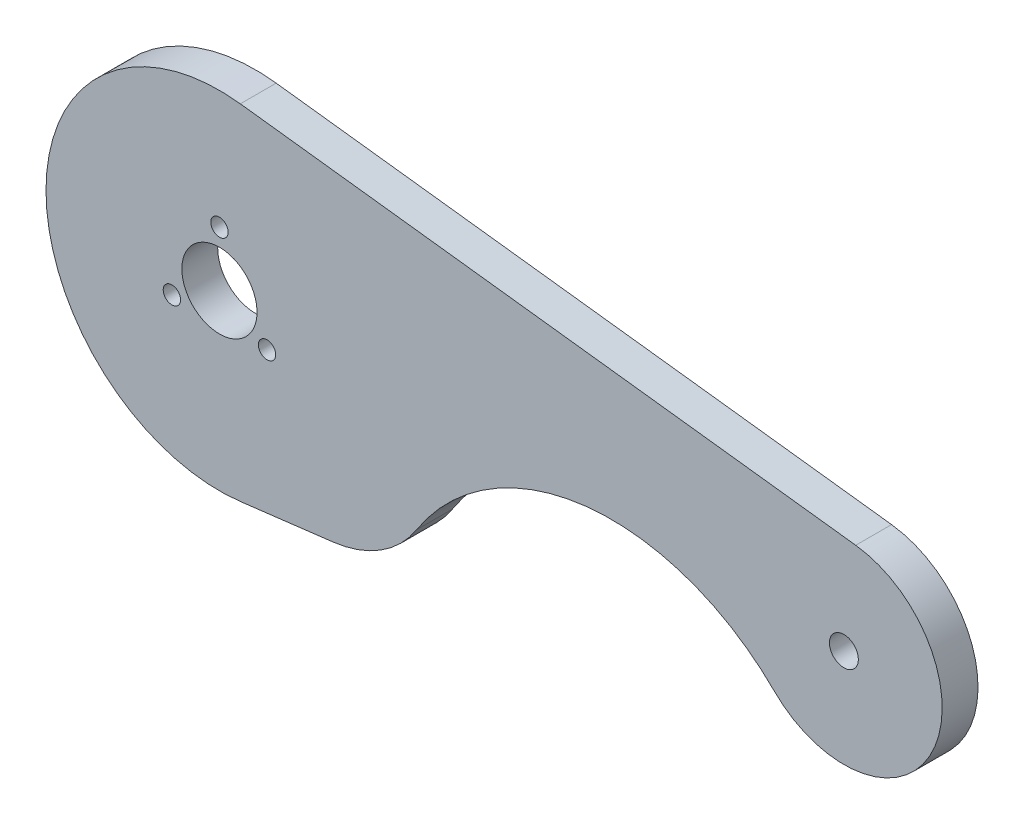
ISO-10303-21;
HEADER;
FILE_DESCRIPTION(('STEP AP214'),'2;1');
FILE_NAME('part.step','',(''),(''),'','','');
FILE_SCHEMA(('AUTOMOTIVE_DESIGN { 1 0 10303 214 1 1 1 1 }'));
ENDSEC;
DATA;
#1=APPLICATION_CONTEXT('core data for automotive mechanical design processes');
#2=APPLICATION_PROTOCOL_DEFINITION('international standard','automotive_design',2000,#1);
#3=PRODUCT_CONTEXT('',#1,'mechanical');
#4=PRODUCT('Part','Part','',(#3));
#5=PRODUCT_RELATED_PRODUCT_CATEGORY('part','',(#4));
#6=PRODUCT_DEFINITION_FORMATION('','',#4);
#7=PRODUCT_DEFINITION_CONTEXT('part definition',#1,'design');
#8=PRODUCT_DEFINITION('design','',#6,#7);
#9=PRODUCT_DEFINITION_SHAPE('','',#8);
#10=(LENGTH_UNIT() NAMED_UNIT(*) SI_UNIT(.MILLI.,.METRE.));
#11=(NAMED_UNIT(*) PLANE_ANGLE_UNIT() SI_UNIT($,.RADIAN.));
#12=(NAMED_UNIT(*) SI_UNIT($,.STERADIAN.) SOLID_ANGLE_UNIT());
#13=UNCERTAINTY_MEASURE_WITH_UNIT(LENGTH_MEASURE(1.E-05),#10,'distance_accuracy_value','');
#14=(GEOMETRIC_REPRESENTATION_CONTEXT(3) GLOBAL_UNCERTAINTY_ASSIGNED_CONTEXT((#13)) GLOBAL_UNIT_ASSIGNED_CONTEXT((#10,
#11,#12)) REPRESENTATION_CONTEXT('',''));
#15=CARTESIAN_POINT('',(0.,0.,0.));
#16=DIRECTION('',(0.,0.,1.));
#17=DIRECTION('',(1.,0.,0.));
#18=AXIS2_PLACEMENT_3D('',#15,#16,#17);
#19=CARTESIAN_POINT('',(17.2612629475506,-7.98027957065537,6.2));
#20=DIRECTION('',(0.,0.,-1.));
#21=DIRECTION('',(-1.,0.,0.));
#22=AXIS2_PLACEMENT_3D('',#19,#20,#21);
#23=CYLINDRICAL_SURFACE('',#22,20.);
#24=CARTESIAN_POINT('',(17.2612629475506,-7.98027957065537,0.));
#25=DIRECTION('',(0.,0.,1.));
#26=DIRECTION('',(1.,0.,0.));
#27=AXIS2_PLACEMENT_3D('',#24,#25,#26);
#28=CIRCLE('',#27,20.);
#29=CARTESIAN_POINT('',(34.095743925818,-18.7784391449695,0.));
#30=VERTEX_POINT('',#29);
#31=CARTESIAN_POINT('',(19.668670354958,-27.8348606434144,0.));
#32=VERTEX_POINT('',#31);
#33=EDGE_CURVE('E122',#30,#32,#28,.F.);
#34=ORIENTED_EDGE('',*,*,#33,.F.);
#35=DIRECTION('',(0.,0.,-1.));
#36=VECTOR('',#35,1.);
#37=CARTESIAN_POINT('',(34.095743925818,-18.7784391449695,6.2));
#38=LINE('',#37,#36);
#39=CARTESIAN_POINT('',(34.095743925818,-18.7784391449695,6.2));
#40=VERTEX_POINT('',#39);
#41=EDGE_CURVE('E11',#40,#30,#38,.T.);
#42=ORIENTED_EDGE('',*,*,#41,.F.);
#43=CARTESIAN_POINT('',(17.2612629475506,-7.98027957065537,6.2));
#44=DIRECTION('',(0.,0.,1.));
#45=DIRECTION('',(1.,0.,0.));
#46=AXIS2_PLACEMENT_3D('',#43,#44,#45);
#47=CIRCLE('',#46,20.);
#48=CARTESIAN_POINT('',(19.668670354958,-27.8348606434144,6.2));
#49=VERTEX_POINT('',#48);
#50=EDGE_CURVE('E141',#40,#49,#47,.F.);
#51=ORIENTED_EDGE('',*,*,#50,.T.);
#52=DIRECTION('',(0.,0.,-1.));
#53=VECTOR('',#52,1.);
#54=CARTESIAN_POINT('',(19.668670354958,-27.8348606434144,6.2));
#55=LINE('',#54,#53);
#56=EDGE_CURVE('E79',#49,#32,#55,.T.);
#57=ORIENTED_EDGE('',*,*,#56,.T.);
#58=EDGE_LOOP('',(#34,#42,#51,#57));
#59=FACE_BOUND('',#58,.T.);
#60=ADVANCED_FACE('F34',(#59),#23,.T.);
#61=CARTESIAN_POINT('',(67.764705882353,-40.3747582935977,6.2));
#62=DIRECTION('',(0.,0.,-1.));
#63=DIRECTION('',(-1.,0.,0.));
#64=AXIS2_PLACEMENT_3D('',#61,#62,#63);
#65=CYLINDRICAL_SURFACE('',#64,40.);
#66=CARTESIAN_POINT('',(67.764705882353,-40.3747582935977,0.));
#67=DIRECTION('',(0.,0.,1.));
#68=DIRECTION('',(1.,0.,0.));
#69=AXIS2_PLACEMENT_3D('',#66,#67,#68);
#70=CIRCLE('',#69,40.);
#71=CARTESIAN_POINT('',(96.,-12.0415945787923,0.));
#72=VERTEX_POINT('',#71);
#73=EDGE_CURVE('E125',#72,#30,#70,.T.);
#74=ORIENTED_EDGE('',*,*,#73,.F.);
#75=DIRECTION('',(0.,0.,-1.));
#76=VECTOR('',#75,1.);
#77=CARTESIAN_POINT('',(96.,-12.0415945787923,6.2));
#78=LINE('',#77,#76);
#79=CARTESIAN_POINT('',(96.,-12.0415945787923,6.2));
#80=VERTEX_POINT('',#79);
#81=EDGE_CURVE('E42',#80,#72,#78,.T.);
#82=ORIENTED_EDGE('',*,*,#81,.F.);
#83=CARTESIAN_POINT('',(67.764705882353,-40.3747582935977,6.2));
#84=DIRECTION('',(0.,0.,1.));
#85=DIRECTION('',(1.,0.,0.));
#86=AXIS2_PLACEMENT_3D('',#83,#84,#85);
#87=CIRCLE('',#86,40.);
#88=EDGE_CURVE('E154',#80,#40,#87,.T.);
#89=ORIENTED_EDGE('',*,*,#88,.T.);
#90=ORIENTED_EDGE('',*,*,#41,.T.);
#91=EDGE_LOOP('',(#74,#82,#89,#90));
#92=FACE_BOUND('',#91,.T.);
#93=ADVANCED_FACE('F153',(#92),#65,.F.);
#94=CARTESIAN_POINT('',(108.,0.,6.2));
#95=DIRECTION('',(0.,0.,-1.));
#96=DIRECTION('',(-1.,0.,0.));
#97=AXIS2_PLACEMENT_3D('',#94,#95,#96);
#98=CYLINDRICAL_SURFACE('',#97,17.);
#99=CARTESIAN_POINT('',(108.,0.,0.));
#100=DIRECTION('',(0.,0.,1.));
#101=DIRECTION('',(1.,0.,0.));
#102=AXIS2_PLACEMENT_3D('',#99,#100,#101);
#103=CIRCLE('',#102,17.);
#104=CARTESIAN_POINT('',(110.046296296296,16.8763939118452,0.));
#105=VERTEX_POINT('',#104);
#106=EDGE_CURVE('E129',#72,#105,#103,.T.);
#107=ORIENTED_EDGE('',*,*,#106,.T.);
#108=DIRECTION('',(0.,0.,-1.));
#109=VECTOR('',#108,1.);
#110=CARTESIAN_POINT('',(110.046296296296,16.8763939118452,6.2));
#111=LINE('',#110,#109);
#112=CARTESIAN_POINT('',(110.046296296296,16.8763939118452,6.2));
#113=VERTEX_POINT('',#112);
#114=EDGE_CURVE('E108',#113,#105,#111,.T.);
#115=ORIENTED_EDGE('',*,*,#114,.F.);
#116=CARTESIAN_POINT('',(108.,0.,6.2));
#117=DIRECTION('',(0.,0.,1.));
#118=DIRECTION('',(1.,0.,0.));
#119=AXIS2_PLACEMENT_3D('',#116,#117,#118);
#120=CIRCLE('',#119,17.);
#121=EDGE_CURVE('E99',#80,#113,#120,.T.);
#122=ORIENTED_EDGE('',*,*,#121,.F.);
#123=ORIENTED_EDGE('',*,*,#81,.T.);
#124=EDGE_LOOP('',(#107,#115,#122,#123));
#125=FACE_BOUND('',#124,.T.);
#126=ADVANCED_FACE('F146',(#125),#98,.T.);
#127=CARTESIAN_POINT('',(3.61111111111111,29.7818716091385,6.2));
#128=DIRECTION('',(-0.12037037037037,-0.99272905363795,0.));
#129=DIRECTION('',(0.99272905363795,-0.12037037037037,0.));
#130=AXIS2_PLACEMENT_3D('',#127,#128,#129);
#131=PLANE('',#130);
#132=DIRECTION('',(-0.99272905363795,0.12037037037037,0.));
#133=VECTOR('',#132,1.);
#134=CARTESIAN_POINT('',(3.61111111111111,29.7818716091385,0.));
#135=LINE('',#134,#133);
#136=CARTESIAN_POINT('',(3.61111111111111,29.7818716091385,0.));
#137=VERTEX_POINT('',#136);
#138=EDGE_CURVE('E107',#105,#137,#135,.T.);
#139=ORIENTED_EDGE('',*,*,#138,.T.);
#140=DIRECTION('',(0.,0.,-1.));
#141=VECTOR('',#140,1.);
#142=CARTESIAN_POINT('',(3.61111111111111,29.7818716091385,6.2));
#143=LINE('',#142,#141);
#144=CARTESIAN_POINT('',(3.61111111111111,29.7818716091385,6.2));
#145=VERTEX_POINT('',#144);
#146=EDGE_CURVE('E104',#145,#137,#143,.T.);
#147=ORIENTED_EDGE('',*,*,#146,.F.);
#148=DIRECTION('',(-0.99272905363795,0.12037037037037,0.));
#149=VECTOR('',#148,1.);
#150=CARTESIAN_POINT('',(3.61111111111111,29.7818716091385,6.2));
#151=LINE('',#150,#149);
#152=EDGE_CURVE('E91',#113,#145,#151,.T.);
#153=ORIENTED_EDGE('',*,*,#152,.F.);
#154=ORIENTED_EDGE('',*,*,#114,.T.);
#155=EDGE_LOOP('',(#139,#147,#153,#154));
#156=FACE_BOUND('',#155,.T.);
#157=ADVANCED_FACE('F105',(#156),#131,.F.);
#158=CARTESIAN_POINT('',(0.,-1.12289643393688E-13,6.2));
#159=DIRECTION('',(0.,0.,-1.));
#160=DIRECTION('',(-1.,0.,0.));
#161=AXIS2_PLACEMENT_3D('',#158,#159,#160);
#162=CYLINDRICAL_SURFACE('',#161,30.);
#163=CARTESIAN_POINT('',(0.,-1.12289643393688E-13,0.));
#164=DIRECTION('',(0.,0.,1.));
#165=DIRECTION('',(1.,0.,0.));
#166=AXIS2_PLACEMENT_3D('',#163,#164,#165);
#167=CIRCLE('',#166,30.);
#168=CARTESIAN_POINT('',(3.61111111111111,-29.7818716091385,0.));
#169=VERTEX_POINT('',#168);
#170=EDGE_CURVE('E72',#137,#169,#167,.T.);
#171=ORIENTED_EDGE('',*,*,#170,.T.);
#172=DIRECTION('',(0.,0.,-1.));
#173=VECTOR('',#172,1.);
#174=CARTESIAN_POINT('',(3.61111111111111,-29.7818716091385,6.2));
#175=LINE('',#174,#173);
#176=CARTESIAN_POINT('',(3.61111111111111,-29.7818716091385,6.2));
#177=VERTEX_POINT('',#176);
#178=EDGE_CURVE('E109',#177,#169,#175,.T.);
#179=ORIENTED_EDGE('',*,*,#178,.F.);
#180=CARTESIAN_POINT('',(0.,-1.12289643393688E-13,6.2));
#181=DIRECTION('',(0.,0.,1.));
#182=DIRECTION('',(1.,0.,0.));
#183=AXIS2_PLACEMENT_3D('',#180,#181,#182);
#184=CIRCLE('',#183,30.);
#185=EDGE_CURVE('E96',#145,#177,#184,.T.);
#186=ORIENTED_EDGE('',*,*,#185,.F.);
#187=ORIENTED_EDGE('',*,*,#146,.T.);
#188=EDGE_LOOP('',(#171,#179,#186,#187));
#189=FACE_BOUND('',#188,.T.);
#190=ADVANCED_FACE('F111',(#189),#162,.T.);
#191=CARTESIAN_POINT('',(0.,-1.12289643393688E-13,6.2));
#192=DIRECTION('',(0.,0.,-1.));
#193=DIRECTION('',(-1.,0.,0.));
#194=AXIS2_PLACEMENT_3D('',#191,#192,#193);
#195=CYLINDRICAL_SURFACE('',#194,6.5);
#196=CARTESIAN_POINT('',(0.,-1.12289643393688E-13,6.2));
#197=DIRECTION('',(0.,0.,1.));
#198=DIRECTION('',(1.,0.,0.));
#199=AXIS2_PLACEMENT_3D('',#196,#197,#198);
#200=CIRCLE('',#199,6.5);
#201=CARTESIAN_POINT('',(-6.5,-1.12289643393688E-13,6.2));
#202=VERTEX_POINT('',#201);
#203=EDGE_CURVE('E113',#202,#202,#200,.T.);
#204=CARTESIAN_POINT('',(0.,-1.12289643393688E-13,0.));
#205=DIRECTION('',(0.,0.,1.));
#206=DIRECTION('',(1.,0.,0.));
#207=AXIS2_PLACEMENT_3D('',#204,#205,#206);
#208=CIRCLE('',#207,6.5);
#209=CARTESIAN_POINT('',(-6.5,-1.12289643393688E-13,0.));
#210=VERTEX_POINT('',#209);
#211=EDGE_CURVE('E135',#210,#210,#208,.T.);
#212=CARTESIAN_POINT('',(-6.5,-1.12289643393688E-13,6.2));
#213=CARTESIAN_POINT('',(-6.5,-1.12289643393688E-13,6.13541666666667));
#214=CARTESIAN_POINT('',(-6.5,-1.12289643393688E-13,6.07083333333333));
#215=CARTESIAN_POINT('',(-6.5,-1.12289643393688E-13,5.94166666666667));
#216=CARTESIAN_POINT('',(-6.5,-1.12289643393688E-13,5.87708333333333));
#217=CARTESIAN_POINT('',(-6.5,-1.12289643393688E-13,5.74791666666667));
#218=CARTESIAN_POINT('',(-6.5,-1.12289643393688E-13,5.68333333333333));
#219=CARTESIAN_POINT('',(-6.5,-1.12289643393688E-13,5.55416666666667));
#220=CARTESIAN_POINT('',(-6.5,-1.12289643393688E-13,5.48958333333333));
#221=CARTESIAN_POINT('',(-6.5,-1.12289643393688E-13,5.36041666666667));
#222=CARTESIAN_POINT('',(-6.5,-1.12289643393688E-13,5.29583333333333));
#223=CARTESIAN_POINT('',(-6.5,-1.12289643393688E-13,5.16666666666667));
#224=CARTESIAN_POINT('',(-6.5,-1.12289643393688E-13,5.10208333333333));
#225=CARTESIAN_POINT('',(-6.5,-1.12289643393688E-13,4.97291666666667));
#226=CARTESIAN_POINT('',(-6.5,-1.12289643393688E-13,4.90833333333333));
#227=CARTESIAN_POINT('',(-6.5,-1.12289643393688E-13,4.77916666666667));
#228=CARTESIAN_POINT('',(-6.5,-1.12289643393688E-13,4.71458333333333));
#229=CARTESIAN_POINT('',(-6.5,-1.12289643393688E-13,4.58541666666667));
#230=CARTESIAN_POINT('',(-6.5,-1.12289643393688E-13,4.52083333333333));
#231=CARTESIAN_POINT('',(-6.5,-1.12289643393688E-13,4.39166666666667));
#232=CARTESIAN_POINT('',(-6.5,-1.12289643393688E-13,4.32708333333333));
#233=CARTESIAN_POINT('',(-6.5,-1.12289643393688E-13,4.19791666666667));
#234=CARTESIAN_POINT('',(-6.5,-1.12289643393688E-13,4.13333333333333));
#235=CARTESIAN_POINT('',(-6.5,-1.12289643393688E-13,4.00416666666667));
#236=CARTESIAN_POINT('',(-6.5,-1.12289643393688E-13,3.93958333333333));
#237=CARTESIAN_POINT('',(-6.5,-1.12289643393688E-13,3.81041666666667));
#238=CARTESIAN_POINT('',(-6.5,-1.12289643393688E-13,3.74583333333333));
#239=CARTESIAN_POINT('',(-6.5,-1.12289643393688E-13,3.61666666666667));
#240=CARTESIAN_POINT('',(-6.5,-1.12289643393688E-13,3.55208333333333));
#241=CARTESIAN_POINT('',(-6.5,-1.12289643393688E-13,3.42291666666667));
#242=CARTESIAN_POINT('',(-6.5,-1.12289643393688E-13,3.35833333333333));
#243=CARTESIAN_POINT('',(-6.5,-1.12289643393688E-13,3.22916666666667));
#244=CARTESIAN_POINT('',(-6.5,-1.12289643393688E-13,3.16458333333333));
#245=CARTESIAN_POINT('',(-6.5,-1.12289643393688E-13,3.03541666666667));
#246=CARTESIAN_POINT('',(-6.5,-1.12289643393688E-13,2.97083333333333));
#247=CARTESIAN_POINT('',(-6.5,-1.12289643393688E-13,2.84166666666667));
#248=CARTESIAN_POINT('',(-6.5,-1.12289643393688E-13,2.77708333333333));
#249=CARTESIAN_POINT('',(-6.5,-1.12289643393688E-13,2.64791666666667));
#250=CARTESIAN_POINT('',(-6.5,-1.12289643393688E-13,2.58333333333333));
#251=CARTESIAN_POINT('',(-6.5,-1.12289643393688E-13,2.45416666666667));
#252=CARTESIAN_POINT('',(-6.5,-1.12289643393688E-13,2.38958333333333));
#253=CARTESIAN_POINT('',(-6.5,-1.12289643393688E-13,2.26041666666667));
#254=CARTESIAN_POINT('',(-6.5,-1.12289643393688E-13,2.19583333333333));
#255=CARTESIAN_POINT('',(-6.5,-1.12289643393688E-13,2.06666666666667));
#256=CARTESIAN_POINT('',(-6.5,-1.12289643393688E-13,2.00208333333333));
#257=CARTESIAN_POINT('',(-6.5,-1.12289643393688E-13,1.87291666666667));
#258=CARTESIAN_POINT('',(-6.5,-1.12289643393688E-13,1.80833333333333));
#259=CARTESIAN_POINT('',(-6.5,-1.12289643393688E-13,1.67916666666667));
#260=CARTESIAN_POINT('',(-6.5,-1.12289643393688E-13,1.61458333333333));
#261=CARTESIAN_POINT('',(-6.5,-1.12289643393688E-13,1.48541666666667));
#262=CARTESIAN_POINT('',(-6.5,-1.12289643393688E-13,1.42083333333333));
#263=CARTESIAN_POINT('',(-6.5,-1.12289643393688E-13,1.29166666666667));
#264=CARTESIAN_POINT('',(-6.5,-1.12289643393688E-13,1.22708333333333));
#265=CARTESIAN_POINT('',(-6.5,-1.12289643393688E-13,1.09791666666667));
#266=CARTESIAN_POINT('',(-6.5,-1.12289643393688E-13,1.03333333333333));
#267=CARTESIAN_POINT('',(-6.5,-1.12289643393688E-13,0.904166666666667));
#268=CARTESIAN_POINT('',(-6.5,-1.12289643393688E-13,0.839583333333333));
#269=CARTESIAN_POINT('',(-6.5,-1.12289643393688E-13,0.710416666666666));
#270=CARTESIAN_POINT('',(-6.5,-1.12289643393688E-13,0.645833333333333));
#271=CARTESIAN_POINT('',(-6.5,-1.12289643393688E-13,0.516666666666667));
#272=CARTESIAN_POINT('',(-6.5,-1.12289643393688E-13,0.452083333333333));
#273=CARTESIAN_POINT('',(-6.5,-1.12289643393688E-13,0.322916666666667));
#274=CARTESIAN_POINT('',(-6.5,-1.12289643393688E-13,0.258333333333334));
#275=CARTESIAN_POINT('',(-6.5,-1.12289643393688E-13,0.129166666666667));
#276=CARTESIAN_POINT('',(-6.5,-1.12289643393688E-13,0.0645833333333335));
#277=CARTESIAN_POINT('',(-6.5,-1.12289643393688E-13,0.));
#278=B_SPLINE_CURVE_WITH_KNOTS('',3,(#212,#213,#214,#215,#216,#217,#218,#219,#220,#221,#222,
#223,#224,#225,#226,#227,#228,#229,#230,#231,#232,#233,#234,#235,#236,#237,#238,#239,#240,#241,
#242,#243,#244,#245,#246,#247,#248,#249,#250,#251,#252,#253,#254,#255,#256,#257,#258,#259,#260,
#261,#262,#263,#264,#265,#266,#267,#268,#269,#270,#271,#272,#273,#274,#275,#276,#277),
.UNSPECIFIED.,.F.,.F.,(4,2,2,2,2,2,2,2,2,2,2,2,2,2,2,2,2,2,2,2,2,2,2,2,2,2,2,2,2,2,2,2,4),(0.,
0.193749999999999,0.3875,0.581249999999999,0.775,0.968749999999999,1.1625,1.35625,1.55,1.74375,
1.9375,2.13125,2.325,2.51875,2.7125,2.90625,3.1,3.29375,3.4875,3.68125,3.875,4.06875,4.2625,
4.45625,4.65,4.84375,5.0375,5.23125,5.425,5.61875,5.8125,6.00625,6.2),.UNSPECIFIED.);
#279=EDGE_CURVE('BSEAM213',#202,#210,#278,.T.);
#280=ORIENTED_EDGE('',*,*,#203,.T.);
#281=ORIENTED_EDGE('',*,*,#211,.F.);
#282=ORIENTED_EDGE('',*,*,#279,.T.);
#283=ORIENTED_EDGE('',*,*,#279,.F.);
#284=EDGE_LOOP('',(#280,#282,#281,#283));
#285=FACE_BOUND('',#284,.T.);
#286=ADVANCED_FACE('F213',(#285),#195,.F.);
#287=CARTESIAN_POINT('',(3.61111111111114,-29.7818716091385,6.2));
#288=DIRECTION('',(-0.120370370370371,0.99272905363795,0.));
#289=DIRECTION('',(-0.99272905363795,-0.120370370370371,0.));
#290=AXIS2_PLACEMENT_3D('',#287,#288,#289);
#291=PLANE('',#290);
#292=DIRECTION('',(0.99272905363795,0.120370370370371,0.));
#293=VECTOR('',#292,1.);
#294=CARTESIAN_POINT('',(3.61111111111114,-29.7818716091385,0.));
#295=LINE('',#294,#293);
#296=EDGE_CURVE('E133',#169,#32,#295,.T.);
#297=ORIENTED_EDGE('',*,*,#296,.T.);
#298=ORIENTED_EDGE('',*,*,#56,.F.);
#299=DIRECTION('',(0.99272905363795,0.120370370370371,0.));
#300=VECTOR('',#299,1.);
#301=CARTESIAN_POINT('',(3.61111111111114,-29.7818716091385,6.2));
#302=LINE('',#301,#300);
#303=EDGE_CURVE('E50',#177,#49,#302,.T.);
#304=ORIENTED_EDGE('',*,*,#303,.F.);
#305=ORIENTED_EDGE('',*,*,#178,.T.);
#306=EDGE_LOOP('',(#297,#298,#304,#305));
#307=FACE_BOUND('',#306,.T.);
#308=ADVANCED_FACE('F157',(#307),#291,.F.);
#309=CARTESIAN_POINT('',(108.,0.,6.2));
#310=DIRECTION('',(0.,0.,-1.));
#311=DIRECTION('',(-1.,0.,0.));
#312=AXIS2_PLACEMENT_3D('',#309,#310,#311);
#313=CYLINDRICAL_SURFACE('',#312,2.50000000000001);
#314=CARTESIAN_POINT('',(108.,0.,6.2));
#315=DIRECTION('',(0.,0.,1.));
#316=DIRECTION('',(1.,0.,0.));
#317=AXIS2_PLACEMENT_3D('',#314,#315,#316);
#318=CIRCLE('',#317,2.50000000000001);
#319=CARTESIAN_POINT('',(105.5,0.,6.2));
#320=VERTEX_POINT('',#319);
#321=EDGE_CURVE('E119',#320,#320,#318,.T.);
#322=CARTESIAN_POINT('',(108.,0.,0.));
#323=DIRECTION('',(0.,0.,1.));
#324=DIRECTION('',(1.,0.,0.));
#325=AXIS2_PLACEMENT_3D('',#322,#323,#324);
#326=CIRCLE('',#325,2.50000000000001);
#327=CARTESIAN_POINT('',(105.5,0.,0.));
#328=VERTEX_POINT('',#327);
#329=EDGE_CURVE('E138',#328,#328,#326,.T.);
#330=CARTESIAN_POINT('',(105.5,0.,6.2));
#331=CARTESIAN_POINT('',(105.5,0.,6.13541666666667));
#332=CARTESIAN_POINT('',(105.5,0.,6.07083333333333));
#333=CARTESIAN_POINT('',(105.5,0.,5.94166666666667));
#334=CARTESIAN_POINT('',(105.5,0.,5.87708333333333));
#335=CARTESIAN_POINT('',(105.5,0.,5.74791666666667));
#336=CARTESIAN_POINT('',(105.5,0.,5.68333333333333));
#337=CARTESIAN_POINT('',(105.5,0.,5.55416666666667));
#338=CARTESIAN_POINT('',(105.5,0.,5.48958333333333));
#339=CARTESIAN_POINT('',(105.5,0.,5.36041666666667));
#340=CARTESIAN_POINT('',(105.5,0.,5.29583333333333));
#341=CARTESIAN_POINT('',(105.5,0.,5.16666666666667));
#342=CARTESIAN_POINT('',(105.5,0.,5.10208333333333));
#343=CARTESIAN_POINT('',(105.5,0.,4.97291666666667));
#344=CARTESIAN_POINT('',(105.5,0.,4.90833333333333));
#345=CARTESIAN_POINT('',(105.5,0.,4.77916666666667));
#346=CARTESIAN_POINT('',(105.5,0.,4.71458333333333));
#347=CARTESIAN_POINT('',(105.5,0.,4.58541666666667));
#348=CARTESIAN_POINT('',(105.5,0.,4.52083333333333));
#349=CARTESIAN_POINT('',(105.5,0.,4.39166666666667));
#350=CARTESIAN_POINT('',(105.5,0.,4.32708333333333));
#351=CARTESIAN_POINT('',(105.5,0.,4.19791666666667));
#352=CARTESIAN_POINT('',(105.5,0.,4.13333333333333));
#353=CARTESIAN_POINT('',(105.5,0.,4.00416666666667));
#354=CARTESIAN_POINT('',(105.5,0.,3.93958333333333));
#355=CARTESIAN_POINT('',(105.5,0.,3.81041666666667));
#356=CARTESIAN_POINT('',(105.5,0.,3.74583333333333));
#357=CARTESIAN_POINT('',(105.5,0.,3.61666666666667));
#358=CARTESIAN_POINT('',(105.5,0.,3.55208333333333));
#359=CARTESIAN_POINT('',(105.5,0.,3.42291666666667));
#360=CARTESIAN_POINT('',(105.5,0.,3.35833333333333));
#361=CARTESIAN_POINT('',(105.5,0.,3.22916666666667));
#362=CARTESIAN_POINT('',(105.5,0.,3.16458333333333));
#363=CARTESIAN_POINT('',(105.5,0.,3.03541666666667));
#364=CARTESIAN_POINT('',(105.5,0.,2.97083333333333));
#365=CARTESIAN_POINT('',(105.5,0.,2.84166666666667));
#366=CARTESIAN_POINT('',(105.5,0.,2.77708333333333));
#367=CARTESIAN_POINT('',(105.5,0.,2.64791666666667));
#368=CARTESIAN_POINT('',(105.5,0.,2.58333333333333));
#369=CARTESIAN_POINT('',(105.5,0.,2.45416666666667));
#370=CARTESIAN_POINT('',(105.5,0.,2.38958333333333));
#371=CARTESIAN_POINT('',(105.5,0.,2.26041666666667));
#372=CARTESIAN_POINT('',(105.5,0.,2.19583333333333));
#373=CARTESIAN_POINT('',(105.5,0.,2.06666666666667));
#374=CARTESIAN_POINT('',(105.5,0.,2.00208333333333));
#375=CARTESIAN_POINT('',(105.5,0.,1.87291666666667));
#376=CARTESIAN_POINT('',(105.5,0.,1.80833333333333));
#377=CARTESIAN_POINT('',(105.5,0.,1.67916666666667));
#378=CARTESIAN_POINT('',(105.5,0.,1.61458333333333));
#379=CARTESIAN_POINT('',(105.5,0.,1.48541666666667));
#380=CARTESIAN_POINT('',(105.5,0.,1.42083333333333));
#381=CARTESIAN_POINT('',(105.5,0.,1.29166666666667));
#382=CARTESIAN_POINT('',(105.5,0.,1.22708333333333));
#383=CARTESIAN_POINT('',(105.5,0.,1.09791666666667));
#384=CARTESIAN_POINT('',(105.5,0.,1.03333333333333));
#385=CARTESIAN_POINT('',(105.5,0.,0.904166666666667));
#386=CARTESIAN_POINT('',(105.5,0.,0.839583333333333));
#387=CARTESIAN_POINT('',(105.5,0.,0.710416666666666));
#388=CARTESIAN_POINT('',(105.5,0.,0.645833333333333));
#389=CARTESIAN_POINT('',(105.5,0.,0.516666666666667));
#390=CARTESIAN_POINT('',(105.5,0.,0.452083333333333));
#391=CARTESIAN_POINT('',(105.5,0.,0.322916666666667));
#392=CARTESIAN_POINT('',(105.5,0.,0.258333333333334));
#393=CARTESIAN_POINT('',(105.5,0.,0.129166666666667));
#394=CARTESIAN_POINT('',(105.5,0.,0.0645833333333335));
#395=CARTESIAN_POINT('',(105.5,0.,0.));
#396=B_SPLINE_CURVE_WITH_KNOTS('',3,(#330,#331,#332,#333,#334,#335,#336,#337,#338,#339,#340,
#341,#342,#343,#344,#345,#346,#347,#348,#349,#350,#351,#352,#353,#354,#355,#356,#357,#358,#359,
#360,#361,#362,#363,#364,#365,#366,#367,#368,#369,#370,#371,#372,#373,#374,#375,#376,#377,#378,
#379,#380,#381,#382,#383,#384,#385,#386,#387,#388,#389,#390,#391,#392,#393,#394,#395),
.UNSPECIFIED.,.F.,.F.,(4,2,2,2,2,2,2,2,2,2,2,2,2,2,2,2,2,2,2,2,2,2,2,2,2,2,2,2,2,2,2,2,4),(0.,
0.193749999999999,0.3875,0.581249999999999,0.775,0.968749999999999,1.1625,1.35625,1.55,1.74375,
1.9375,2.13125,2.325,2.51875,2.7125,2.90625,3.1,3.29375,3.4875,3.68125,3.875,4.06875,4.2625,
4.45625,4.65,4.84375,5.0375,5.23125,5.425,5.61875,5.8125,6.00625,6.2),.UNSPECIFIED.);
#397=EDGE_CURVE('BSEAM216',#320,#328,#396,.T.);
#398=ORIENTED_EDGE('',*,*,#321,.T.);
#399=ORIENTED_EDGE('',*,*,#329,.F.);
#400=ORIENTED_EDGE('',*,*,#397,.T.);
#401=ORIENTED_EDGE('',*,*,#397,.F.);
#402=EDGE_LOOP('',(#398,#400,#399,#401));
#403=FACE_BOUND('',#402,.T.);
#404=ADVANCED_FACE('F216',(#403),#313,.F.);
#405=CARTESIAN_POINT('',(0.,0.,6.2));
#406=DIRECTION('',(0.,0.,1.));
#407=DIRECTION('',(1.,0.,0.));
#408=AXIS2_PLACEMENT_3D('',#405,#406,#407);
#409=PLANE('',#408);
#410=CARTESIAN_POINT('',(-8.22724133595216,-4.75000000000012,6.2));
#411=DIRECTION('',(0.,0.,1.));
#412=DIRECTION('',(1.,0.,0.));
#413=AXIS2_PLACEMENT_3D('',#410,#411,#412);
#414=CIRCLE('',#413,1.5);
#415=CARTESIAN_POINT('',(-6.72724133595217,-4.75000000000012,6.2));
#416=VERTEX_POINT('',#415);
#417=EDGE_CURVE('E173',#416,#416,#414,.F.);
#418=ORIENTED_EDGE('',*,*,#417,.T.);
#419=EDGE_LOOP('',(#418));
#420=FACE_BOUND('',#419,.T.);
#421=CARTESIAN_POINT('',(8.22724133595281,-4.74999999999901,6.2));
#422=DIRECTION('',(0.,0.,1.));
#423=DIRECTION('',(1.,0.,0.));
#424=AXIS2_PLACEMENT_3D('',#421,#422,#423);
#425=CIRCLE('',#424,1.5);
#426=CARTESIAN_POINT('',(9.72724133595281,-4.74999999999901,6.2));
#427=VERTEX_POINT('',#426);
#428=EDGE_CURVE('E167',#427,#427,#425,.F.);
#429=ORIENTED_EDGE('',*,*,#428,.T.);
#430=EDGE_LOOP('',(#429));
#431=FACE_BOUND('',#430,.T.);
#432=CARTESIAN_POINT('',(-2.53879494805833E-12,9.49999999999989,6.2));
#433=DIRECTION('',(0.,0.,1.));
#434=DIRECTION('',(1.,0.,0.));
#435=AXIS2_PLACEMENT_3D('',#432,#433,#434);
#436=CIRCLE('',#435,1.5);
#437=CARTESIAN_POINT('',(1.49999999999746,9.49999999999989,6.2));
#438=VERTEX_POINT('',#437);
#439=EDGE_CURVE('E161',#438,#438,#436,.F.);
#440=ORIENTED_EDGE('',*,*,#439,.T.);
#441=EDGE_LOOP('',(#440));
#442=FACE_BOUND('',#441,.T.);
#443=ORIENTED_EDGE('',*,*,#50,.F.);
#444=ORIENTED_EDGE('',*,*,#88,.F.);
#445=ORIENTED_EDGE('',*,*,#121,.T.);
#446=ORIENTED_EDGE('',*,*,#152,.T.);
#447=ORIENTED_EDGE('',*,*,#185,.T.);
#448=ORIENTED_EDGE('',*,*,#303,.T.);
#449=EDGE_LOOP('',(#443,#444,#445,#446,#447,#448));
#450=FACE_BOUND('',#449,.T.);
#451=ORIENTED_EDGE('',*,*,#203,.F.);
#452=EDGE_LOOP('',(#451));
#453=FACE_BOUND('',#452,.T.);
#454=ORIENTED_EDGE('',*,*,#321,.F.);
#455=EDGE_LOOP('',(#454));
#456=FACE_BOUND('',#455,.T.);
#457=ADVANCED_FACE('F93',(#420,#431,#442,#450,#453,#456),#409,.T.);
#458=CARTESIAN_POINT('',(0.,0.,0.));
#459=DIRECTION('',(0.,0.,1.));
#460=DIRECTION('',(1.,0.,0.));
#461=AXIS2_PLACEMENT_3D('',#458,#459,#460);
#462=PLANE('',#461);
#463=CARTESIAN_POINT('',(-8.22724133595216,-4.75000000000012,0.));
#464=DIRECTION('',(0.,0.,-1.));
#465=DIRECTION('',(-1.,0.,0.));
#466=AXIS2_PLACEMENT_3D('',#463,#464,#465);
#467=CIRCLE('',#466,1.5);
#468=CARTESIAN_POINT('',(-9.72724133595216,-4.75000000000012,0.));
#469=VERTEX_POINT('',#468);
#470=EDGE_CURVE('E126',#469,#469,#467,.T.);
#471=ORIENTED_EDGE('',*,*,#470,.F.);
#472=EDGE_LOOP('',(#471));
#473=FACE_BOUND('',#472,.T.);
#474=CARTESIAN_POINT('',(8.22724133595281,-4.74999999999901,0.));
#475=DIRECTION('',(0.,0.,-1.));
#476=DIRECTION('',(-1.,0.,0.));
#477=AXIS2_PLACEMENT_3D('',#474,#475,#476);
#478=CIRCLE('',#477,1.5);
#479=CARTESIAN_POINT('',(6.7272413359528,-4.74999999999901,0.));
#480=VERTEX_POINT('',#479);
#481=EDGE_CURVE('E170',#480,#480,#478,.T.);
#482=ORIENTED_EDGE('',*,*,#481,.F.);
#483=EDGE_LOOP('',(#482));
#484=FACE_BOUND('',#483,.T.);
#485=CARTESIAN_POINT('',(-2.53879494805833E-12,9.49999999999989,0.));
#486=DIRECTION('',(0.,0.,-1.));
#487=DIRECTION('',(-1.,0.,0.));
#488=AXIS2_PLACEMENT_3D('',#485,#486,#487);
#489=CIRCLE('',#488,1.5);
#490=CARTESIAN_POINT('',(-1.50000000000254,9.49999999999989,0.));
#491=VERTEX_POINT('',#490);
#492=EDGE_CURVE('E164',#491,#491,#489,.T.);
#493=ORIENTED_EDGE('',*,*,#492,.F.);
#494=EDGE_LOOP('',(#493));
#495=FACE_BOUND('',#494,.T.);
#496=ORIENTED_EDGE('',*,*,#33,.T.);
#497=ORIENTED_EDGE('',*,*,#296,.F.);
#498=ORIENTED_EDGE('',*,*,#170,.F.);
#499=ORIENTED_EDGE('',*,*,#138,.F.);
#500=ORIENTED_EDGE('',*,*,#106,.F.);
#501=ORIENTED_EDGE('',*,*,#73,.T.);
#502=EDGE_LOOP('',(#496,#497,#498,#499,#500,#501));
#503=FACE_BOUND('',#502,.T.);
#504=ORIENTED_EDGE('',*,*,#211,.T.);
#505=EDGE_LOOP('',(#504));
#506=FACE_BOUND('',#505,.T.);
#507=ORIENTED_EDGE('',*,*,#329,.T.);
#508=EDGE_LOOP('',(#507));
#509=FACE_BOUND('',#508,.T.);
#510=ADVANCED_FACE('F151',(#473,#484,#495,#503,#506,#509),#462,.F.);
#511=CARTESIAN_POINT('',(-2.53879494805833E-12,9.49999999999989,6.201));
#512=DIRECTION('',(0.,0.,-1.));
#513=DIRECTION('',(-1.,0.,0.));
#514=AXIS2_PLACEMENT_3D('',#511,#512,#513);
#515=CYLINDRICAL_SURFACE('',#514,1.5);
#516=ORIENTED_EDGE('',*,*,#439,.F.);
#517=EDGE_LOOP('',(#516));
#518=FACE_BOUND('',#517,.T.);
#519=ORIENTED_EDGE('',*,*,#492,.T.);
#520=EDGE_LOOP('',(#519));
#521=FACE_BOUND('',#520,.T.);
#522=ADVANCED_FACE('F183',(#518,#521),#515,.F.);
#523=CARTESIAN_POINT('',(8.22724133595281,-4.74999999999901,6.201));
#524=DIRECTION('',(0.,0.,-1.));
#525=DIRECTION('',(-1.,0.,0.));
#526=AXIS2_PLACEMENT_3D('',#523,#524,#525);
#527=CYLINDRICAL_SURFACE('',#526,1.5);
#528=ORIENTED_EDGE('',*,*,#428,.F.);
#529=EDGE_LOOP('',(#528));
#530=FACE_BOUND('',#529,.T.);
#531=ORIENTED_EDGE('',*,*,#481,.T.);
#532=EDGE_LOOP('',(#531));
#533=FACE_BOUND('',#532,.T.);
#534=ADVANCED_FACE('F190',(#530,#533),#527,.F.);
#535=CARTESIAN_POINT('',(-8.22724133595216,-4.75000000000012,6.201));
#536=DIRECTION('',(0.,0.,-1.));
#537=DIRECTION('',(-1.,0.,0.));
#538=AXIS2_PLACEMENT_3D('',#535,#536,#537);
#539=CYLINDRICAL_SURFACE('',#538,1.5);
#540=ORIENTED_EDGE('',*,*,#417,.F.);
#541=EDGE_LOOP('',(#540));
#542=FACE_BOUND('',#541,.T.);
#543=ORIENTED_EDGE('',*,*,#470,.T.);
#544=EDGE_LOOP('',(#543));
#545=FACE_BOUND('',#544,.T.);
#546=ADVANCED_FACE('F179',(#542,#545),#539,.F.);
#547=CLOSED_SHELL('',(#60,#93,#126,#157,#190,#286,#308,#404,#457,#510,#522,#534,#546));
#548=MANIFOLD_SOLID_BREP('B2',#547);
#549=ADVANCED_BREP_SHAPE_REPRESENTATION('',(#18,#548),#14);
#550=SHAPE_DEFINITION_REPRESENTATION(#9,#549);
ENDSEC;
END-ISO-10303-21;
